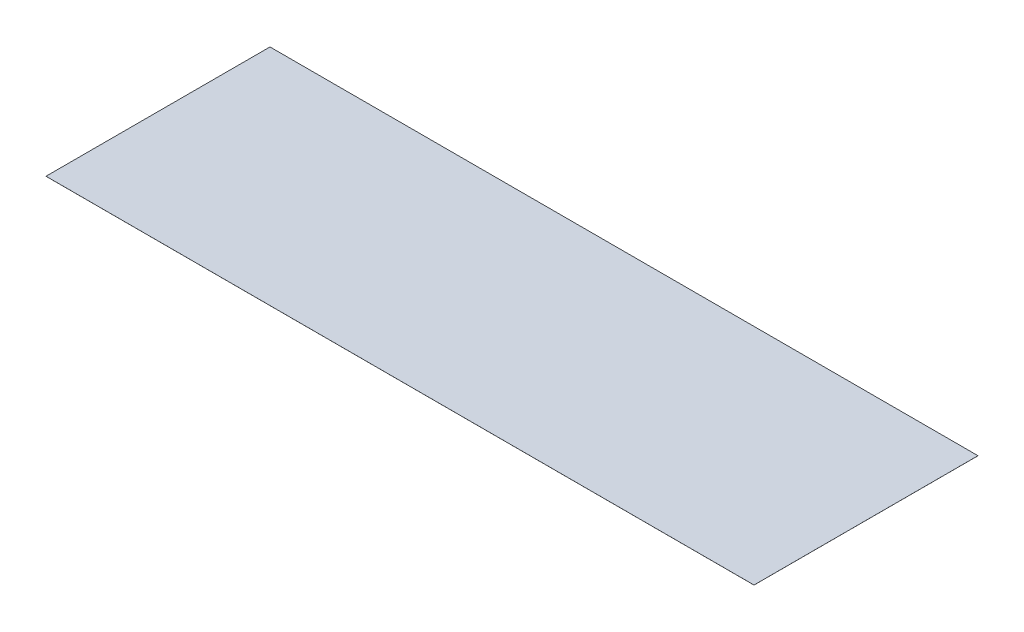
ISO-10303-21;
HEADER;
FILE_DESCRIPTION(('STEP AP214'),'2;1');
FILE_NAME('part.step','',(''),(''),'','','');
FILE_SCHEMA(('AUTOMOTIVE_DESIGN { 1 0 10303 214 1 1 1 1 }'));
ENDSEC;
DATA;
#1=APPLICATION_CONTEXT('core data for automotive mechanical design processes');
#2=APPLICATION_PROTOCOL_DEFINITION('international standard','automotive_design',2000,#1);
#3=PRODUCT_CONTEXT('',#1,'mechanical');
#4=PRODUCT('Part','Part','',(#3));
#5=PRODUCT_RELATED_PRODUCT_CATEGORY('part','',(#4));
#6=PRODUCT_DEFINITION_FORMATION('','',#4);
#7=PRODUCT_DEFINITION_CONTEXT('part definition',#1,'design');
#8=PRODUCT_DEFINITION('design','',#6,#7);
#9=PRODUCT_DEFINITION_SHAPE('','',#8);
#10=(LENGTH_UNIT() NAMED_UNIT(*) SI_UNIT(.MILLI.,.METRE.));
#11=(NAMED_UNIT(*) PLANE_ANGLE_UNIT() SI_UNIT($,.RADIAN.));
#12=(NAMED_UNIT(*) SI_UNIT($,.STERADIAN.) SOLID_ANGLE_UNIT());
#13=UNCERTAINTY_MEASURE_WITH_UNIT(LENGTH_MEASURE(1.E-05),#10,'distance_accuracy_value','');
#14=(GEOMETRIC_REPRESENTATION_CONTEXT(3) GLOBAL_UNCERTAINTY_ASSIGNED_CONTEXT((#13)) GLOBAL_UNIT_ASSIGNED_CONTEXT((#10,
#11,#12)) REPRESENTATION_CONTEXT('',''));
#15=CARTESIAN_POINT('',(0.,0.,0.));
#16=DIRECTION('',(0.,0.,1.));
#17=DIRECTION('',(1.,0.,0.));
#18=AXIS2_PLACEMENT_3D('',#15,#16,#17);
#19=CARTESIAN_POINT('',(0.,6.35,0.));
#20=DIRECTION('',(-1.,0.,0.));
#21=DIRECTION('',(0.,0.,1.));
#22=AXIS2_PLACEMENT_3D('',#19,#20,#21);
#23=PLANE('',#22);
#24=DIRECTION('',(0.,0.,-1.));
#25=VECTOR('',#24,1.);
#26=CARTESIAN_POINT('',(0.,0.,0.));
#27=LINE('',#26,#25);
#28=CARTESIAN_POINT('',(0.,0.,0.));
#29=VERTEX_POINT('',#28);
#30=CARTESIAN_POINT('',(0.,0.,-31633.2581988447));
#31=VERTEX_POINT('',#30);
#32=EDGE_CURVE('E11',#29,#31,#27,.T.);
#33=ORIENTED_EDGE('',*,*,#32,.T.);
#34=DIRECTION('',(0.,-1.,0.));
#35=VECTOR('',#34,1.);
#36=CARTESIAN_POINT('',(0.,6.35,-31633.2581988447));
#37=LINE('',#36,#35);
#38=CARTESIAN_POINT('',(0.,6.35,-31633.2581988447));
#39=VERTEX_POINT('',#38);
#40=EDGE_CURVE('E36',#39,#31,#37,.T.);
#41=ORIENTED_EDGE('',*,*,#40,.F.);
#42=DIRECTION('',(0.,0.,-1.));
#43=VECTOR('',#42,1.);
#44=CARTESIAN_POINT('',(0.,6.35,0.));
#45=LINE('',#44,#43);
#46=CARTESIAN_POINT('',(0.,6.35,0.));
#47=VERTEX_POINT('',#46);
#48=EDGE_CURVE('E73',#47,#39,#45,.T.);
#49=ORIENTED_EDGE('',*,*,#48,.F.);
#50=DIRECTION('',(0.,-1.,0.));
#51=VECTOR('',#50,1.);
#52=CARTESIAN_POINT('',(0.,6.35,0.));
#53=LINE('',#52,#51);
#54=EDGE_CURVE('E27',#47,#29,#53,.T.);
#55=ORIENTED_EDGE('',*,*,#54,.T.);
#56=EDGE_LOOP('',(#33,#41,#49,#55));
#57=FACE_BOUND('',#56,.T.);
#58=ADVANCED_FACE('F17',(#57),#23,.F.);
#59=CARTESIAN_POINT('',(0.,6.35,-31633.2581988447));
#60=DIRECTION('',(0.,0.,1.));
#61=DIRECTION('',(1.,0.,0.));
#62=AXIS2_PLACEMENT_3D('',#59,#60,#61);
#63=PLANE('',#62);
#64=DIRECTION('',(-1.,0.,0.));
#65=VECTOR('',#64,1.);
#66=CARTESIAN_POINT('',(0.,0.,-31633.2581988447));
#67=LINE('',#66,#65);
#68=CARTESIAN_POINT('',(-100000.,0.,-31633.2581988447));
#69=VERTEX_POINT('',#68);
#70=EDGE_CURVE('E80',#31,#69,#67,.T.);
#71=ORIENTED_EDGE('',*,*,#70,.T.);
#72=DIRECTION('',(0.,-1.,0.));
#73=VECTOR('',#72,1.);
#74=CARTESIAN_POINT('',(-100000.,6.35,-31633.2581988447));
#75=LINE('',#74,#73);
#76=CARTESIAN_POINT('',(-100000.,6.35,-31633.2581988447));
#77=VERTEX_POINT('',#76);
#78=EDGE_CURVE('E86',#77,#69,#75,.T.);
#79=ORIENTED_EDGE('',*,*,#78,.F.);
#80=DIRECTION('',(-1.,0.,0.));
#81=VECTOR('',#80,1.);
#82=CARTESIAN_POINT('',(0.,6.35,-31633.2581988447));
#83=LINE('',#82,#81);
#84=EDGE_CURVE('E64',#39,#77,#83,.T.);
#85=ORIENTED_EDGE('',*,*,#84,.F.);
#86=ORIENTED_EDGE('',*,*,#40,.T.);
#87=EDGE_LOOP('',(#71,#79,#85,#86));
#88=FACE_BOUND('',#87,.T.);
#89=ADVANCED_FACE('F90',(#88),#63,.F.);
#90=CARTESIAN_POINT('',(-100000.,6.35,0.));
#91=DIRECTION('',(1.,0.,0.));
#92=DIRECTION('',(0.,0.,-1.));
#93=AXIS2_PLACEMENT_3D('',#90,#91,#92);
#94=PLANE('',#93);
#95=DIRECTION('',(0.,0.,1.));
#96=VECTOR('',#95,1.);
#97=CARTESIAN_POINT('',(-100000.,0.,0.));
#98=LINE('',#97,#96);
#99=CARTESIAN_POINT('',(-100000.,0.,0.));
#100=VERTEX_POINT('',#99);
#101=EDGE_CURVE('E70',#69,#100,#98,.T.);
#102=ORIENTED_EDGE('',*,*,#101,.T.);
#103=DIRECTION('',(0.,-1.,0.));
#104=VECTOR('',#103,1.);
#105=CARTESIAN_POINT('',(-100000.,6.35,0.));
#106=LINE('',#105,#104);
#107=CARTESIAN_POINT('',(-100000.,6.35,0.));
#108=VERTEX_POINT('',#107);
#109=EDGE_CURVE('E56',#108,#100,#106,.T.);
#110=ORIENTED_EDGE('',*,*,#109,.F.);
#111=DIRECTION('',(0.,0.,1.));
#112=VECTOR('',#111,1.);
#113=CARTESIAN_POINT('',(-100000.,6.35,0.));
#114=LINE('',#113,#112);
#115=EDGE_CURVE('E62',#77,#108,#114,.T.);
#116=ORIENTED_EDGE('',*,*,#115,.F.);
#117=ORIENTED_EDGE('',*,*,#78,.T.);
#118=EDGE_LOOP('',(#102,#110,#116,#117));
#119=FACE_BOUND('',#118,.T.);
#120=ADVANCED_FACE('F68',(#119),#94,.F.);
#121=CARTESIAN_POINT('',(0.,6.35,0.));
#122=DIRECTION('',(0.,0.,-1.));
#123=DIRECTION('',(-1.,0.,0.));
#124=AXIS2_PLACEMENT_3D('',#121,#122,#123);
#125=PLANE('',#124);
#126=DIRECTION('',(1.,0.,0.));
#127=VECTOR('',#126,1.);
#128=CARTESIAN_POINT('',(0.,0.,0.));
#129=LINE('',#128,#127);
#130=EDGE_CURVE('E72',#100,#29,#129,.T.);
#131=ORIENTED_EDGE('',*,*,#130,.T.);
#132=ORIENTED_EDGE('',*,*,#54,.F.);
#133=DIRECTION('',(1.,0.,0.));
#134=VECTOR('',#133,1.);
#135=CARTESIAN_POINT('',(0.,6.35,0.));
#136=LINE('',#135,#134);
#137=EDGE_CURVE('E21',#108,#47,#136,.T.);
#138=ORIENTED_EDGE('',*,*,#137,.F.);
#139=ORIENTED_EDGE('',*,*,#109,.T.);
#140=EDGE_LOOP('',(#131,#132,#138,#139));
#141=FACE_BOUND('',#140,.T.);
#142=ADVANCED_FACE('F76',(#141),#125,.F.);
#143=CARTESIAN_POINT('',(0.,6.35,0.));
#144=DIRECTION('',(0.,1.,0.));
#145=DIRECTION('',(0.,0.,1.));
#146=AXIS2_PLACEMENT_3D('',#143,#144,#145);
#147=PLANE('',#146);
#148=ORIENTED_EDGE('',*,*,#48,.T.);
#149=ORIENTED_EDGE('',*,*,#84,.T.);
#150=ORIENTED_EDGE('',*,*,#115,.T.);
#151=ORIENTED_EDGE('',*,*,#137,.T.);
#152=EDGE_LOOP('',(#148,#149,#150,#151));
#153=FACE_BOUND('',#152,.T.);
#154=ADVANCED_FACE('F63',(#153),#147,.T.);
#155=CARTESIAN_POINT('',(0.,0.,0.));
#156=DIRECTION('',(0.,1.,0.));
#157=DIRECTION('',(0.,0.,1.));
#158=AXIS2_PLACEMENT_3D('',#155,#156,#157);
#159=PLANE('',#158);
#160=ORIENTED_EDGE('',*,*,#32,.F.);
#161=ORIENTED_EDGE('',*,*,#130,.F.);
#162=ORIENTED_EDGE('',*,*,#101,.F.);
#163=ORIENTED_EDGE('',*,*,#70,.F.);
#164=EDGE_LOOP('',(#160,#161,#162,#163));
#165=FACE_BOUND('',#164,.T.);
#166=ADVANCED_FACE('F19',(#165),#159,.F.);
#167=CLOSED_SHELL('',(#58,#89,#120,#142,#154,#166));
#168=MANIFOLD_SOLID_BREP('B1',#167);
#169=ADVANCED_BREP_SHAPE_REPRESENTATION('',(#18,#168),#14);
#170=SHAPE_DEFINITION_REPRESENTATION(#9,#169);
ENDSEC;
END-ISO-10303-21;
